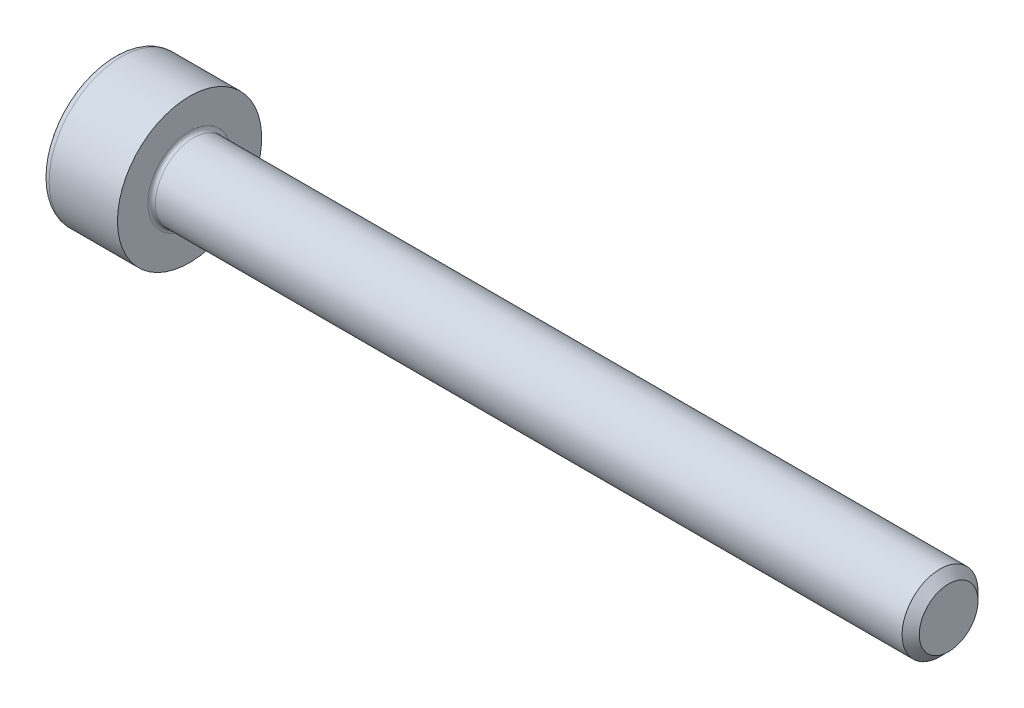
ISO-10303-21;
HEADER;
FILE_DESCRIPTION(('STEP AP214'),'2;1');
FILE_NAME('part.step','',(''),(''),'','','');
FILE_SCHEMA(('AUTOMOTIVE_DESIGN { 1 0 10303 214 1 1 1 1 }'));
ENDSEC;
DATA;
#1=APPLICATION_CONTEXT('core data for automotive mechanical design processes');
#2=APPLICATION_PROTOCOL_DEFINITION('international standard','automotive_design',2000,#1);
#3=PRODUCT_CONTEXT('',#1,'mechanical');
#4=PRODUCT('Part','Part','',(#3));
#5=PRODUCT_RELATED_PRODUCT_CATEGORY('part','',(#4));
#6=PRODUCT_DEFINITION_FORMATION('','',#4);
#7=PRODUCT_DEFINITION_CONTEXT('part definition',#1,'design');
#8=PRODUCT_DEFINITION('design','',#6,#7);
#9=PRODUCT_DEFINITION_SHAPE('','',#8);
#10=(LENGTH_UNIT() NAMED_UNIT(*) SI_UNIT(.MILLI.,.METRE.));
#11=(NAMED_UNIT(*) PLANE_ANGLE_UNIT() SI_UNIT($,.RADIAN.));
#12=(NAMED_UNIT(*) SI_UNIT($,.STERADIAN.) SOLID_ANGLE_UNIT());
#13=UNCERTAINTY_MEASURE_WITH_UNIT(LENGTH_MEASURE(1.E-05),#10,'distance_accuracy_value','');
#14=(GEOMETRIC_REPRESENTATION_CONTEXT(3) GLOBAL_UNCERTAINTY_ASSIGNED_CONTEXT((#13)) GLOBAL_UNIT_ASSIGNED_CONTEXT((#10,
#11,#12)) REPRESENTATION_CONTEXT('',''));
#15=CARTESIAN_POINT('',(0.,0.,0.));
#16=DIRECTION('',(0.,0.,1.));
#17=DIRECTION('',(1.,0.,0.));
#18=AXIS2_PLACEMENT_3D('',#15,#16,#17);
#19=CARTESIAN_POINT('',(0.,0.,0.));
#20=DIRECTION('',(-1.,0.,0.));
#21=DIRECTION('',(0.,0.,1.));
#22=AXIS2_PLACEMENT_3D('',#19,#20,#21);
#23=PLANE('',#22);
#24=DIRECTION('',(0.,-0.499999999999999,0.866025403784439));
#25=VECTOR('',#24,1.);
#26=CARTESIAN_POINT('',(0.,0.877572409168226,0.));
#27=LINE('',#26,#25);
#28=CARTESIAN_POINT('',(0.,0.877572409168226,0.));
#29=VERTEX_POINT('',#28);
#30=CARTESIAN_POINT('',(0.,0.438786204584111,0.759999999999998));
#31=VERTEX_POINT('',#30);
#32=EDGE_CURVE('E261',#29,#31,#27,.T.);
#33=ORIENTED_EDGE('',*,*,#32,.T.);
#34=DIRECTION('',(0.,1.,0.));
#35=VECTOR('',#34,1.);
#36=CARTESIAN_POINT('',(0.,-0.43878620458412,0.759999999999999));
#37=LINE('',#36,#35);
#38=CARTESIAN_POINT('',(0.,-0.43878620458412,0.759999999999999));
#39=VERTEX_POINT('',#38);
#40=EDGE_CURVE('E133',#39,#31,#37,.T.);
#41=ORIENTED_EDGE('',*,*,#40,.F.);
#42=DIRECTION('',(0.,-0.500000000000001,-0.866025403784438));
#43=VECTOR('',#42,1.);
#44=CARTESIAN_POINT('',(0.,-0.43878620458412,0.759999999999999));
#45=LINE('',#44,#43);
#46=CARTESIAN_POINT('',(0.,-0.877572409168237,0.));
#47=VERTEX_POINT('',#46);
#48=EDGE_CURVE('E264',#39,#47,#45,.T.);
#49=ORIENTED_EDGE('',*,*,#48,.T.);
#50=DIRECTION('',(0.,0.499999999999999,-0.866025403784439));
#51=VECTOR('',#50,1.);
#52=CARTESIAN_POINT('',(0.,-0.877572409168237,0.));
#53=LINE('',#52,#51);
#54=CARTESIAN_POINT('',(0.,-0.438786204584122,-0.76));
#55=VERTEX_POINT('',#54);
#56=EDGE_CURVE('E267',#47,#55,#53,.T.);
#57=ORIENTED_EDGE('',*,*,#56,.T.);
#58=DIRECTION('',(0.,-1.,0.));
#59=VECTOR('',#58,1.);
#60=CARTESIAN_POINT('',(0.,0.438786204584109,-0.760000000000001));
#61=LINE('',#60,#59);
#62=CARTESIAN_POINT('',(0.,0.438786204584109,-0.760000000000001));
#63=VERTEX_POINT('',#62);
#64=EDGE_CURVE('E270',#63,#55,#61,.T.);
#65=ORIENTED_EDGE('',*,*,#64,.F.);
#66=DIRECTION('',(0.,-0.500000000000001,-0.866025403784438));
#67=VECTOR('',#66,1.);
#68=CARTESIAN_POINT('',(0.,0.877572409168226,0.));
#69=LINE('',#68,#67);
#70=EDGE_CURVE('E128',#29,#63,#69,.T.);
#71=ORIENTED_EDGE('',*,*,#70,.F.);
#72=EDGE_LOOP('',(#33,#41,#49,#57,#65,#71));
#73=FACE_BOUND('',#72,.T.);
#74=CARTESIAN_POINT('',(0.,0.,0.));
#75=DIRECTION('',(-1.,0.,0.));
#76=DIRECTION('',(0.,0.,1.));
#77=AXIS2_PLACEMENT_3D('',#74,#75,#76);
#78=CIRCLE('',#77,1.7);
#79=CARTESIAN_POINT('',(0.,0.,1.7));
#80=VERTEX_POINT('',#79);
#81=EDGE_CURVE('E45',#80,#80,#78,.T.);
#82=ORIENTED_EDGE('',*,*,#81,.T.);
#83=EDGE_LOOP('',(#82));
#84=FACE_BOUND('',#83,.T.);
#85=ADVANCED_FACE('F37',(#73,#84),#23,.T.);
#86=CARTESIAN_POINT('',(-31.75,0.,0.));
#87=DIRECTION('',(-1.,0.,0.));
#88=DIRECTION('',(0.,0.,1.));
#89=AXIS2_PLACEMENT_3D('',#86,#87,#88);
#90=CYLINDRICAL_SURFACE('',#89,1.9);
#91=CARTESIAN_POINT('',(0.199999999999999,0.,0.));
#92=DIRECTION('',(-1.,0.,0.));
#93=DIRECTION('',(0.,0.,1.));
#94=AXIS2_PLACEMENT_3D('',#91,#92,#93);
#95=CIRCLE('',#94,1.9);
#96=CARTESIAN_POINT('',(0.199999999999999,0.,1.9));
#97=VERTEX_POINT('',#96);
#98=EDGE_CURVE('E11',#97,#97,#95,.F.);
#99=ORIENTED_EDGE('',*,*,#98,.T.);
#100=EDGE_LOOP('',(#99));
#101=FACE_BOUND('',#100,.T.);
#102=CARTESIAN_POINT('',(2.,0.,0.));
#103=DIRECTION('',(-1.,0.,0.));
#104=DIRECTION('',(0.,0.,1.));
#105=AXIS2_PLACEMENT_3D('',#102,#103,#104);
#106=CIRCLE('',#105,1.9);
#107=CARTESIAN_POINT('',(2.,0.,1.9));
#108=VERTEX_POINT('',#107);
#109=EDGE_CURVE('E151',#108,#108,#106,.T.);
#110=ORIENTED_EDGE('',*,*,#109,.T.);
#111=EDGE_LOOP('',(#110));
#112=FACE_BOUND('',#111,.T.);
#113=ADVANCED_FACE('F175',(#101,#112),#90,.T.);
#114=CARTESIAN_POINT('',(2.,1.9,0.));
#115=DIRECTION('',(1.,0.,0.));
#116=DIRECTION('',(0.,0.,-1.));
#117=AXIS2_PLACEMENT_3D('',#114,#115,#116);
#118=PLANE('',#117);
#119=CARTESIAN_POINT('',(2.,0.,0.));
#120=DIRECTION('',(1.,0.,0.));
#121=DIRECTION('',(0.,0.,-1.));
#122=AXIS2_PLACEMENT_3D('',#119,#120,#121);
#123=CIRCLE('',#122,1.1);
#124=CARTESIAN_POINT('',(2.,0.,-1.1));
#125=VERTEX_POINT('',#124);
#126=EDGE_CURVE('E154',#125,#125,#123,.F.);
#127=ORIENTED_EDGE('',*,*,#126,.T.);
#128=EDGE_LOOP('',(#127));
#129=FACE_BOUND('',#128,.T.);
#130=ORIENTED_EDGE('',*,*,#109,.F.);
#131=EDGE_LOOP('',(#130));
#132=FACE_BOUND('',#131,.T.);
#133=ADVANCED_FACE('F181',(#129,#132),#118,.T.);
#134=CARTESIAN_POINT('',(-31.75,0.,0.));
#135=DIRECTION('',(-1.,0.,0.));
#136=DIRECTION('',(0.,0.,1.));
#137=AXIS2_PLACEMENT_3D('',#134,#135,#136);
#138=CYLINDRICAL_SURFACE('',#137,0.999999999999998);
#139=CARTESIAN_POINT('',(2.1,0.,0.));
#140=DIRECTION('',(1.,0.,0.));
#141=DIRECTION('',(0.,0.,-1.));
#142=AXIS2_PLACEMENT_3D('',#139,#140,#141);
#143=CIRCLE('',#142,0.999999999999998);
#144=CARTESIAN_POINT('',(2.1,0.,-0.999999999999998));
#145=VERTEX_POINT('',#144);
#146=EDGE_CURVE('E157',#145,#145,#143,.T.);
#147=ORIENTED_EDGE('',*,*,#146,.T.);
#148=EDGE_LOOP('',(#147));
#149=FACE_BOUND('',#148,.T.);
#150=CARTESIAN_POINT('',(21.774,0.,0.));
#151=DIRECTION('',(-1.,0.,0.));
#152=DIRECTION('',(0.,0.,1.));
#153=AXIS2_PLACEMENT_3D('',#150,#151,#152);
#154=CIRCLE('',#153,0.999999999999996);
#155=CARTESIAN_POINT('',(21.774,0.,0.999999999999996));
#156=VERTEX_POINT('',#155);
#157=EDGE_CURVE('E148',#156,#156,#154,.T.);
#158=ORIENTED_EDGE('',*,*,#157,.T.);
#159=EDGE_LOOP('',(#158));
#160=FACE_BOUND('',#159,.T.);
#161=ADVANCED_FACE('F187',(#149,#160),#138,.T.);
#162=CARTESIAN_POINT('',(22.,0.,0.));
#163=DIRECTION('',(-1.,0.,0.));
#164=DIRECTION('',(0.,0.,1.));
#165=AXIS2_PLACEMENT_3D('',#162,#163,#164);
#166=CONICAL_SURFACE('',#165,0.774,0.785398163397446);
#167=ORIENTED_EDGE('',*,*,#157,.F.);
#168=EDGE_LOOP('',(#167));
#169=FACE_BOUND('',#168,.T.);
#170=CARTESIAN_POINT('',(22.,0.,0.));
#171=DIRECTION('',(-1.,0.,0.));
#172=DIRECTION('',(0.,0.,1.));
#173=AXIS2_PLACEMENT_3D('',#170,#171,#172);
#174=CIRCLE('',#173,0.774);
#175=CARTESIAN_POINT('',(22.,0.,0.774));
#176=VERTEX_POINT('',#175);
#177=EDGE_CURVE('E144',#176,#176,#174,.T.);
#178=ORIENTED_EDGE('',*,*,#177,.T.);
#179=EDGE_LOOP('',(#178));
#180=FACE_BOUND('',#179,.T.);
#181=ADVANCED_FACE('F191',(#169,#180),#166,.T.);
#182=CARTESIAN_POINT('',(22.,0.774,0.));
#183=DIRECTION('',(1.,0.,0.));
#184=DIRECTION('',(0.,0.,-1.));
#185=AXIS2_PLACEMENT_3D('',#182,#183,#184);
#186=PLANE('',#185);
#187=ORIENTED_EDGE('',*,*,#177,.F.);
#188=EDGE_LOOP('',(#187));
#189=FACE_BOUND('',#188,.T.);
#190=ADVANCED_FACE('F171',(#189),#186,.T.);
#191=CARTESIAN_POINT('',(2.1,0.,0.));
#192=DIRECTION('',(1.,0.,0.));
#193=DIRECTION('',(0.,0.,-1.));
#194=AXIS2_PLACEMENT_3D('',#191,#192,#193);
#195=TOROIDAL_SURFACE('',#194,1.1,0.1);
#196=ORIENTED_EDGE('',*,*,#146,.F.);
#197=EDGE_LOOP('',(#196));
#198=FACE_BOUND('',#197,.T.);
#199=ORIENTED_EDGE('',*,*,#126,.F.);
#200=EDGE_LOOP('',(#199));
#201=FACE_BOUND('',#200,.T.);
#202=ADVANCED_FACE('F164',(#198,#201),#195,.F.);
#203=CARTESIAN_POINT('',(0.199999999999999,0.,0.));
#204=DIRECTION('',(-1.,0.,0.));
#205=DIRECTION('',(0.,0.,1.));
#206=AXIS2_PLACEMENT_3D('',#203,#204,#205);
#207=TOROIDAL_SURFACE('',#206,1.7,0.2);
#208=ORIENTED_EDGE('',*,*,#98,.F.);
#209=EDGE_LOOP('',(#208));
#210=FACE_BOUND('',#209,.T.);
#211=ORIENTED_EDGE('',*,*,#81,.F.);
#212=EDGE_LOOP('',(#211));
#213=FACE_BOUND('',#212,.T.);
#214=ADVANCED_FACE('F39',(#210,#213),#207,.T.);
#215=CARTESIAN_POINT('',(1.,0.877572409168226,0.));
#216=DIRECTION('',(0.,-0.866025403784439,-0.499999999999999));
#217=DIRECTION('',(0.,0.499999999999999,-0.866025403784439));
#218=AXIS2_PLACEMENT_3D('',#215,#216,#217);
#219=PLANE('',#218);
#220=ORIENTED_EDGE('',*,*,#32,.F.);
#221=DIRECTION('',(-1.,0.,0.));
#222=VECTOR('',#221,1.);
#223=CARTESIAN_POINT('',(1.,0.877572409168226,0.));
#224=LINE('',#223,#222);
#225=CARTESIAN_POINT('',(1.,0.877572409168226,0.));
#226=VERTEX_POINT('',#225);
#227=EDGE_CURVE('E251',#226,#29,#224,.T.);
#228=ORIENTED_EDGE('',*,*,#227,.F.);
#229=DIRECTION('',(0.,-0.499999999999999,0.866025403784439));
#230=VECTOR('',#229,1.);
#231=CARTESIAN_POINT('',(1.,0.877572409168226,0.));
#232=LINE('',#231,#230);
#233=CARTESIAN_POINT('',(1.,0.658179306876169,0.379999999999997));
#234=VERTEX_POINT('',#233);
#235=EDGE_CURVE('E120',#226,#234,#232,.T.);
#236=ORIENTED_EDGE('',*,*,#235,.T.);
#237=CARTESIAN_POINT('',(1.,0.438786204584111,0.759999999999998));
#238=VERTEX_POINT('',#237);
#239=EDGE_CURVE('E111',#234,#238,#232,.T.);
#240=ORIENTED_EDGE('',*,*,#239,.T.);
#241=DIRECTION('',(-1.,0.,0.));
#242=VECTOR('',#241,1.);
#243=CARTESIAN_POINT('',(1.,0.438786204584111,0.759999999999998));
#244=LINE('',#243,#242);
#245=EDGE_CURVE('E125',#238,#31,#244,.T.);
#246=ORIENTED_EDGE('',*,*,#245,.T.);
#247=EDGE_LOOP('',(#220,#228,#236,#240,#246));
#248=FACE_BOUND('',#247,.T.);
#249=ADVANCED_FACE('F124',(#248),#219,.T.);
#250=CARTESIAN_POINT('',(1.,-0.43878620458412,0.759999999999999));
#251=DIRECTION('',(0.,0.,1.));
#252=DIRECTION('',(0.,-1.,0.));
#253=AXIS2_PLACEMENT_3D('',#250,#251,#252);
#254=PLANE('',#253);
#255=ORIENTED_EDGE('',*,*,#40,.T.);
#256=ORIENTED_EDGE('',*,*,#245,.F.);
#257=DIRECTION('',(0.,1.,0.));
#258=VECTOR('',#257,1.);
#259=CARTESIAN_POINT('',(1.,-0.43878620458412,0.759999999999999));
#260=LINE('',#259,#258);
#261=CARTESIAN_POINT('',(1.,0.,0.759999999999999));
#262=VERTEX_POINT('',#261);
#263=EDGE_CURVE('E108',#262,#238,#260,.T.);
#264=ORIENTED_EDGE('',*,*,#263,.F.);
#265=CARTESIAN_POINT('',(1.,-0.43878620458412,0.759999999999999));
#266=VERTEX_POINT('',#265);
#267=EDGE_CURVE('E119',#266,#262,#260,.T.);
#268=ORIENTED_EDGE('',*,*,#267,.F.);
#269=DIRECTION('',(-1.,0.,0.));
#270=VECTOR('',#269,1.);
#271=CARTESIAN_POINT('',(1.,-0.43878620458412,0.759999999999999));
#272=LINE('',#271,#270);
#273=EDGE_CURVE('E135',#266,#39,#272,.T.);
#274=ORIENTED_EDGE('',*,*,#273,.T.);
#275=EDGE_LOOP('',(#255,#256,#264,#268,#274));
#276=FACE_BOUND('',#275,.T.);
#277=ADVANCED_FACE('F130',(#276),#254,.F.);
#278=CARTESIAN_POINT('',(1.,-0.43878620458412,0.759999999999999));
#279=DIRECTION('',(0.,0.866025403784438,-0.500000000000001));
#280=DIRECTION('',(0.,0.500000000000001,0.866025403784438));
#281=AXIS2_PLACEMENT_3D('',#278,#279,#280);
#282=PLANE('',#281);
#283=ORIENTED_EDGE('',*,*,#48,.F.);
#284=ORIENTED_EDGE('',*,*,#273,.F.);
#285=DIRECTION('',(0.,-0.500000000000001,-0.866025403784438));
#286=VECTOR('',#285,1.);
#287=CARTESIAN_POINT('',(1.,-0.43878620458412,0.759999999999999));
#288=LINE('',#287,#286);
#289=CARTESIAN_POINT('',(1.,-0.658179306876177,0.380000000000003));
#290=VERTEX_POINT('',#289);
#291=EDGE_CURVE('E290',#266,#290,#288,.T.);
#292=ORIENTED_EDGE('',*,*,#291,.T.);
#293=CARTESIAN_POINT('',(1.,-0.877572409168237,0.));
#294=VERTEX_POINT('',#293);
#295=EDGE_CURVE('E279',#290,#294,#288,.T.);
#296=ORIENTED_EDGE('',*,*,#295,.T.);
#297=DIRECTION('',(-1.,0.,0.));
#298=VECTOR('',#297,1.);
#299=CARTESIAN_POINT('',(1.,-0.877572409168237,0.));
#300=LINE('',#299,#298);
#301=EDGE_CURVE('E140',#294,#47,#300,.T.);
#302=ORIENTED_EDGE('',*,*,#301,.T.);
#303=EDGE_LOOP('',(#283,#284,#292,#296,#302));
#304=FACE_BOUND('',#303,.T.);
#305=ADVANCED_FACE('F205',(#304),#282,.T.);
#306=CARTESIAN_POINT('',(1.,-0.877572409168237,0.));
#307=DIRECTION('',(0.,0.866025403784439,0.499999999999999));
#308=DIRECTION('',(0.,-0.499999999999999,0.866025403784439));
#309=AXIS2_PLACEMENT_3D('',#306,#307,#308);
#310=PLANE('',#309);
#311=ORIENTED_EDGE('',*,*,#56,.F.);
#312=ORIENTED_EDGE('',*,*,#301,.F.);
#313=DIRECTION('',(0.,0.499999999999999,-0.866025403784439));
#314=VECTOR('',#313,1.);
#315=CARTESIAN_POINT('',(1.,-0.877572409168237,0.));
#316=LINE('',#315,#314);
#317=CARTESIAN_POINT('',(1.,-0.658179306876178,-0.380000000000002));
#318=VERTEX_POINT('',#317);
#319=EDGE_CURVE('E257',#294,#318,#316,.T.);
#320=ORIENTED_EDGE('',*,*,#319,.T.);
#321=CARTESIAN_POINT('',(1.,-0.438786204584122,-0.76));
#322=VERTEX_POINT('',#321);
#323=EDGE_CURVE('E289',#318,#322,#316,.T.);
#324=ORIENTED_EDGE('',*,*,#323,.T.);
#325=DIRECTION('',(-1.,0.,0.));
#326=VECTOR('',#325,1.);
#327=CARTESIAN_POINT('',(1.,-0.438786204584122,-0.76));
#328=LINE('',#327,#326);
#329=EDGE_CURVE('E250',#322,#55,#328,.T.);
#330=ORIENTED_EDGE('',*,*,#329,.T.);
#331=EDGE_LOOP('',(#311,#312,#320,#324,#330));
#332=FACE_BOUND('',#331,.T.);
#333=ADVANCED_FACE('F208',(#332),#310,.T.);
#334=CARTESIAN_POINT('',(1.,0.438786204584109,-0.760000000000001));
#335=DIRECTION('',(0.,0.,-1.));
#336=DIRECTION('',(0.,1.,0.));
#337=AXIS2_PLACEMENT_3D('',#334,#335,#336);
#338=PLANE('',#337);
#339=ORIENTED_EDGE('',*,*,#64,.T.);
#340=ORIENTED_EDGE('',*,*,#329,.F.);
#341=DIRECTION('',(0.,-1.,0.));
#342=VECTOR('',#341,1.);
#343=CARTESIAN_POINT('',(1.,0.438786204584109,-0.760000000000001));
#344=LINE('',#343,#342);
#345=CARTESIAN_POINT('',(1.,0.,-0.76));
#346=VERTEX_POINT('',#345);
#347=EDGE_CURVE('E254',#346,#322,#344,.T.);
#348=ORIENTED_EDGE('',*,*,#347,.F.);
#349=CARTESIAN_POINT('',(1.,0.438786204584109,-0.760000000000001));
#350=VERTEX_POINT('',#349);
#351=EDGE_CURVE('E52',#350,#346,#344,.T.);
#352=ORIENTED_EDGE('',*,*,#351,.F.);
#353=DIRECTION('',(-1.,0.,0.));
#354=VECTOR('',#353,1.);
#355=CARTESIAN_POINT('',(1.,0.438786204584109,-0.760000000000001));
#356=LINE('',#355,#354);
#357=EDGE_CURVE('E247',#350,#63,#356,.T.);
#358=ORIENTED_EDGE('',*,*,#357,.T.);
#359=EDGE_LOOP('',(#339,#340,#348,#352,#358));
#360=FACE_BOUND('',#359,.T.);
#361=ADVANCED_FACE('F212',(#360),#338,.F.);
#362=CARTESIAN_POINT('',(1.,0.877572409168226,0.));
#363=DIRECTION('',(0.,0.866025403784438,-0.500000000000001));
#364=DIRECTION('',(0.,0.500000000000001,0.866025403784438));
#365=AXIS2_PLACEMENT_3D('',#362,#363,#364);
#366=PLANE('',#365);
#367=ORIENTED_EDGE('',*,*,#70,.T.);
#368=ORIENTED_EDGE('',*,*,#357,.F.);
#369=DIRECTION('',(0.,-0.500000000000001,-0.866025403784438));
#370=VECTOR('',#369,1.);
#371=CARTESIAN_POINT('',(1.,0.877572409168226,0.));
#372=LINE('',#371,#370);
#373=CARTESIAN_POINT('',(1.,0.658179306876169,-0.379999999999999));
#374=VERTEX_POINT('',#373);
#375=EDGE_CURVE('E237',#374,#350,#372,.T.);
#376=ORIENTED_EDGE('',*,*,#375,.F.);
#377=EDGE_CURVE('E243',#226,#374,#372,.T.);
#378=ORIENTED_EDGE('',*,*,#377,.F.);
#379=ORIENTED_EDGE('',*,*,#227,.T.);
#380=EDGE_LOOP('',(#367,#368,#376,#378,#379));
#381=FACE_BOUND('',#380,.T.);
#382=ADVANCED_FACE('F216',(#381),#366,.F.);
#383=CARTESIAN_POINT('',(1.,0.877572409168226,0.));
#384=DIRECTION('',(1.,0.,0.));
#385=DIRECTION('',(0.,0.,-1.));
#386=AXIS2_PLACEMENT_3D('',#383,#384,#385);
#387=PLANE('',#386);
#388=ORIENTED_EDGE('',*,*,#347,.T.);
#389=ORIENTED_EDGE('',*,*,#323,.F.);
#390=CARTESIAN_POINT('',(1.,0.,0.));
#391=DIRECTION('',(-1.,0.,0.));
#392=DIRECTION('',(0.,0.,1.));
#393=AXIS2_PLACEMENT_3D('',#390,#391,#392);
#394=CIRCLE('',#393,0.76);
#395=EDGE_CURVE('E285',#346,#318,#394,.T.);
#396=ORIENTED_EDGE('',*,*,#395,.F.);
#397=EDGE_LOOP('',(#388,#389,#396));
#398=FACE_BOUND('',#397,.T.);
#399=ADVANCED_FACE('F220',(#398),#387,.F.);
#400=ORIENTED_EDGE('',*,*,#319,.F.);
#401=ORIENTED_EDGE('',*,*,#295,.F.);
#402=EDGE_CURVE('E138',#318,#290,#394,.T.);
#403=ORIENTED_EDGE('',*,*,#402,.F.);
#404=EDGE_LOOP('',(#400,#401,#403));
#405=FACE_BOUND('',#404,.T.);
#406=ADVANCED_FACE('F223',(#405),#387,.F.);
#407=ORIENTED_EDGE('',*,*,#291,.F.);
#408=ORIENTED_EDGE('',*,*,#267,.T.);
#409=EDGE_CURVE('E134',#290,#262,#394,.T.);
#410=ORIENTED_EDGE('',*,*,#409,.F.);
#411=EDGE_LOOP('',(#407,#408,#410));
#412=FACE_BOUND('',#411,.T.);
#413=ADVANCED_FACE('F228',(#412),#387,.F.);
#414=ORIENTED_EDGE('',*,*,#263,.T.);
#415=ORIENTED_EDGE('',*,*,#239,.F.);
#416=EDGE_CURVE('E114',#262,#234,#394,.T.);
#417=ORIENTED_EDGE('',*,*,#416,.F.);
#418=EDGE_LOOP('',(#414,#415,#417));
#419=FACE_BOUND('',#418,.T.);
#420=ADVANCED_FACE('F110',(#419),#387,.F.);
#421=ORIENTED_EDGE('',*,*,#235,.F.);
#422=ORIENTED_EDGE('',*,*,#377,.T.);
#423=EDGE_CURVE('E145',#234,#374,#394,.T.);
#424=ORIENTED_EDGE('',*,*,#423,.F.);
#425=EDGE_LOOP('',(#421,#422,#424));
#426=FACE_BOUND('',#425,.T.);
#427=ADVANCED_FACE('F231',(#426),#387,.F.);
#428=ORIENTED_EDGE('',*,*,#375,.T.);
#429=ORIENTED_EDGE('',*,*,#351,.T.);
#430=EDGE_CURVE('E240',#374,#346,#394,.T.);
#431=ORIENTED_EDGE('',*,*,#430,.F.);
#432=EDGE_LOOP('',(#428,#429,#431));
#433=FACE_BOUND('',#432,.T.);
#434=ADVANCED_FACE('F201',(#433),#387,.F.);
#435=CARTESIAN_POINT('',(1.,0.,0.));
#436=DIRECTION('',(-1.,0.,0.));
#437=DIRECTION('',(0.,0.,1.));
#438=AXIS2_PLACEMENT_3D('',#435,#436,#437);
#439=CONICAL_SURFACE('',#438,0.76,1.0471975511966);
#440=CARTESIAN_POINT('',(1.43878620458412,0.,0.));
#441=VERTEX_POINT('',#440);
#442=VERTEX_LOOP('',#441);
#443=FACE_BOUND('',#442,.T.);
#444=ORIENTED_EDGE('',*,*,#416,.T.);
#445=ORIENTED_EDGE('',*,*,#423,.T.);
#446=ORIENTED_EDGE('',*,*,#430,.T.);
#447=ORIENTED_EDGE('',*,*,#395,.T.);
#448=ORIENTED_EDGE('',*,*,#402,.T.);
#449=ORIENTED_EDGE('',*,*,#409,.T.);
#450=EDGE_LOOP('',(#444,#445,#446,#447,#448,#449));
#451=FACE_BOUND('',#450,.T.);
#452=ADVANCED_FACE('F199',(#443,#451),#439,.F.);
#453=CLOSED_SHELL('',(#85,#113,#133,#161,#181,#190,#202,#214,#249,#277,#305,#333,#361,#382,#399,
#406,#413,#420,#427,#434,#452));
#454=MANIFOLD_SOLID_BREP('B2',#453);
#455=ADVANCED_BREP_SHAPE_REPRESENTATION('',(#18,#454),#14);
#456=SHAPE_DEFINITION_REPRESENTATION(#9,#455);
ENDSEC;
END-ISO-10303-21;
